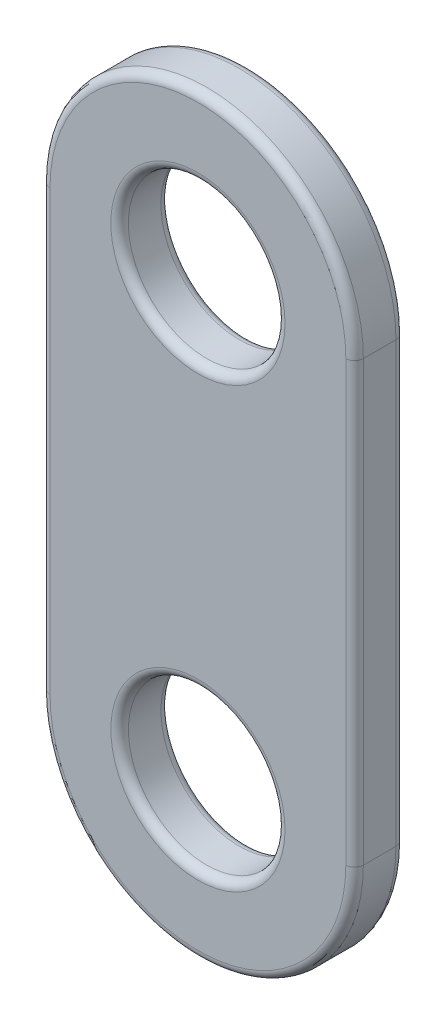
ISO-10303-21;
HEADER;
FILE_DESCRIPTION(('STEP AP214'),'2;1');
FILE_NAME('part.step','',(''),(''),'','','');
FILE_SCHEMA(('AUTOMOTIVE_DESIGN { 1 0 10303 214 1 1 1 1 }'));
ENDSEC;
DATA;
#1=APPLICATION_CONTEXT('core data for automotive mechanical design processes');
#2=APPLICATION_PROTOCOL_DEFINITION('international standard','automotive_design',2000,#1);
#3=PRODUCT_CONTEXT('',#1,'mechanical');
#4=PRODUCT('Part','Part','',(#3));
#5=PRODUCT_RELATED_PRODUCT_CATEGORY('part','',(#4));
#6=PRODUCT_DEFINITION_FORMATION('','',#4);
#7=PRODUCT_DEFINITION_CONTEXT('part definition',#1,'design');
#8=PRODUCT_DEFINITION('design','',#6,#7);
#9=PRODUCT_DEFINITION_SHAPE('','',#8);
#10=(LENGTH_UNIT() NAMED_UNIT(*) SI_UNIT(.MILLI.,.METRE.));
#11=(NAMED_UNIT(*) PLANE_ANGLE_UNIT() SI_UNIT($,.RADIAN.));
#12=(NAMED_UNIT(*) SI_UNIT($,.STERADIAN.) SOLID_ANGLE_UNIT());
#13=UNCERTAINTY_MEASURE_WITH_UNIT(LENGTH_MEASURE(1.E-05),#10,'distance_accuracy_value','');
#14=(GEOMETRIC_REPRESENTATION_CONTEXT(3) GLOBAL_UNCERTAINTY_ASSIGNED_CONTEXT((#13)) GLOBAL_UNIT_ASSIGNED_CONTEXT((#10,
#11,#12)) REPRESENTATION_CONTEXT('',''));
#15=CARTESIAN_POINT('',(0.,0.,0.));
#16=DIRECTION('',(0.,0.,1.));
#17=DIRECTION('',(1.,0.,0.));
#18=AXIS2_PLACEMENT_3D('',#15,#16,#17);
#19=CARTESIAN_POINT('',(0.,-22.225,0.));
#20=DIRECTION('',(0.,0.,-1.));
#21=DIRECTION('',(-1.,0.,0.));
#22=AXIS2_PLACEMENT_3D('',#19,#20,#21);
#23=CYLINDRICAL_SURFACE('',#22,15.875);
#24=DIRECTION('',(0.,0.,-1.));
#25=VECTOR('',#24,1.);
#26=CARTESIAN_POINT('',(-15.875,-22.225,5.08));
#27=LINE('',#26,#25);
#28=CARTESIAN_POINT('',(-15.875,-22.225,0.889));
#29=VERTEX_POINT('',#28);
#30=CARTESIAN_POINT('',(-15.875,-22.225,4.191));
#31=VERTEX_POINT('',#30);
#32=EDGE_CURVE('E239',#29,#31,#27,.F.);
#33=ORIENTED_EDGE('',*,*,#32,.F.);
#34=CARTESIAN_POINT('',(0.,-22.225,0.889));
#35=DIRECTION('',(0.,0.,1.));
#36=DIRECTION('',(1.,0.,0.));
#37=AXIS2_PLACEMENT_3D('',#34,#35,#36);
#38=CIRCLE('',#37,15.875);
#39=CARTESIAN_POINT('',(15.875,-22.225,0.889));
#40=VERTEX_POINT('',#39);
#41=EDGE_CURVE('E184',#29,#40,#38,.T.);
#42=ORIENTED_EDGE('',*,*,#41,.T.);
#43=DIRECTION('',(0.,0.,-1.));
#44=VECTOR('',#43,1.);
#45=CARTESIAN_POINT('',(15.875,-22.225,5.08));
#46=LINE('',#45,#44);
#47=CARTESIAN_POINT('',(15.875,-22.225,4.191));
#48=VERTEX_POINT('',#47);
#49=EDGE_CURVE('E133',#48,#40,#46,.T.);
#50=ORIENTED_EDGE('',*,*,#49,.F.);
#51=CARTESIAN_POINT('',(0.,-22.225,4.191));
#52=DIRECTION('',(0.,0.,1.));
#53=DIRECTION('',(1.,0.,0.));
#54=AXIS2_PLACEMENT_3D('',#51,#52,#53);
#55=CIRCLE('',#54,15.875);
#56=EDGE_CURVE('E181',#48,#31,#55,.F.);
#57=ORIENTED_EDGE('',*,*,#56,.T.);
#58=EDGE_LOOP('',(#33,#42,#50,#57));
#59=FACE_BOUND('',#58,.T.);
#60=ADVANCED_FACE('F43',(#59),#23,.T.);
#61=CARTESIAN_POINT('',(0.,22.225,0.));
#62=DIRECTION('',(0.,0.,-1.));
#63=DIRECTION('',(-1.,0.,0.));
#64=AXIS2_PLACEMENT_3D('',#61,#62,#63);
#65=CYLINDRICAL_SURFACE('',#64,15.875);
#66=DIRECTION('',(0.,0.,-1.));
#67=VECTOR('',#66,1.);
#68=CARTESIAN_POINT('',(15.875,22.225,5.08));
#69=LINE('',#68,#67);
#70=CARTESIAN_POINT('',(15.875,22.225,0.889));
#71=VERTEX_POINT('',#70);
#72=CARTESIAN_POINT('',(15.875,22.225,4.191));
#73=VERTEX_POINT('',#72);
#74=EDGE_CURVE('E214',#71,#73,#69,.F.);
#75=ORIENTED_EDGE('',*,*,#74,.F.);
#76=CARTESIAN_POINT('',(0.,22.225,0.889));
#77=DIRECTION('',(0.,0.,1.));
#78=DIRECTION('',(1.,0.,0.));
#79=AXIS2_PLACEMENT_3D('',#76,#77,#78);
#80=CIRCLE('',#79,15.875);
#81=CARTESIAN_POINT('',(-15.875,22.225,0.889));
#82=VERTEX_POINT('',#81);
#83=EDGE_CURVE('E118',#71,#82,#80,.T.);
#84=ORIENTED_EDGE('',*,*,#83,.T.);
#85=DIRECTION('',(0.,0.,-1.));
#86=VECTOR('',#85,1.);
#87=CARTESIAN_POINT('',(-15.875,22.225,5.08));
#88=LINE('',#87,#86);
#89=CARTESIAN_POINT('',(-15.875,22.225,4.191));
#90=VERTEX_POINT('',#89);
#91=EDGE_CURVE('E248',#90,#82,#88,.T.);
#92=ORIENTED_EDGE('',*,*,#91,.F.);
#93=CARTESIAN_POINT('',(0.,22.225,4.191));
#94=DIRECTION('',(0.,0.,1.));
#95=DIRECTION('',(1.,0.,0.));
#96=AXIS2_PLACEMENT_3D('',#93,#94,#95);
#97=CIRCLE('',#96,15.875);
#98=EDGE_CURVE('E169',#90,#73,#97,.F.);
#99=ORIENTED_EDGE('',*,*,#98,.T.);
#100=EDGE_LOOP('',(#75,#84,#92,#99));
#101=FACE_BOUND('',#100,.T.);
#102=ADVANCED_FACE('F263',(#101),#65,.T.);
#103=CARTESIAN_POINT('',(0.,0.,5.08));
#104=DIRECTION('',(0.,0.,1.));
#105=DIRECTION('',(1.,0.,0.));
#106=AXIS2_PLACEMENT_3D('',#103,#104,#105);
#107=PLANE('',#106);
#108=CARTESIAN_POINT('',(0.,-22.225,5.08));
#109=DIRECTION('',(0.,0.,1.));
#110=DIRECTION('',(1.,0.,0.));
#111=AXIS2_PLACEMENT_3D('',#108,#109,#110);
#112=CIRCLE('',#111,8.8265);
#113=CARTESIAN_POINT('',(8.82650000000001,-22.225,5.08));
#114=VERTEX_POINT('',#113);
#115=EDGE_CURVE('E11',#114,#114,#112,.F.);
#116=ORIENTED_EDGE('',*,*,#115,.T.);
#117=EDGE_LOOP('',(#116));
#118=FACE_BOUND('',#117,.T.);
#119=DIRECTION('',(0.,1.,0.));
#120=VECTOR('',#119,1.);
#121=CARTESIAN_POINT('',(14.986,22.225,5.08));
#122=LINE('',#121,#120);
#123=CARTESIAN_POINT('',(14.986,-22.225,5.08));
#124=VERTEX_POINT('',#123);
#125=CARTESIAN_POINT('',(14.986,22.225,5.08));
#126=VERTEX_POINT('',#125);
#127=EDGE_CURVE('E61',#124,#126,#122,.T.);
#128=ORIENTED_EDGE('',*,*,#127,.T.);
#129=CARTESIAN_POINT('',(0.,22.225,5.08));
#130=DIRECTION('',(0.,0.,1.));
#131=DIRECTION('',(1.,0.,0.));
#132=AXIS2_PLACEMENT_3D('',#129,#130,#131);
#133=CIRCLE('',#132,14.986);
#134=CARTESIAN_POINT('',(-14.986,22.225,5.08));
#135=VERTEX_POINT('',#134);
#136=EDGE_CURVE('E53',#126,#135,#133,.T.);
#137=ORIENTED_EDGE('',*,*,#136,.T.);
#138=DIRECTION('',(0.,-1.,0.));
#139=VECTOR('',#138,1.);
#140=CARTESIAN_POINT('',(-14.986,-22.225,5.08));
#141=LINE('',#140,#139);
#142=CARTESIAN_POINT('',(-14.986,-22.225,5.08));
#143=VERTEX_POINT('',#142);
#144=EDGE_CURVE('E197',#135,#143,#141,.T.);
#145=ORIENTED_EDGE('',*,*,#144,.T.);
#146=CARTESIAN_POINT('',(0.,-22.225,5.08));
#147=DIRECTION('',(0.,0.,1.));
#148=DIRECTION('',(1.,0.,0.));
#149=AXIS2_PLACEMENT_3D('',#146,#147,#148);
#150=CIRCLE('',#149,14.986);
#151=EDGE_CURVE('E66',#143,#124,#150,.T.);
#152=ORIENTED_EDGE('',*,*,#151,.T.);
#153=EDGE_LOOP('',(#128,#137,#145,#152));
#154=FACE_BOUND('',#153,.T.);
#155=CARTESIAN_POINT('',(0.,22.225,5.08));
#156=DIRECTION('',(0.,0.,1.));
#157=DIRECTION('',(1.,0.,0.));
#158=AXIS2_PLACEMENT_3D('',#155,#156,#157);
#159=CIRCLE('',#158,8.8265);
#160=CARTESIAN_POINT('',(8.82649999999999,22.225,5.08));
#161=VERTEX_POINT('',#160);
#162=EDGE_CURVE('E193',#161,#161,#159,.F.);
#163=ORIENTED_EDGE('',*,*,#162,.T.);
#164=EDGE_LOOP('',(#163));
#165=FACE_BOUND('',#164,.T.);
#166=ADVANCED_FACE('F277',(#118,#154,#165),#107,.T.);
#167=CARTESIAN_POINT('',(0.,0.,0.));
#168=DIRECTION('',(0.,0.,1.));
#169=DIRECTION('',(1.,0.,0.));
#170=AXIS2_PLACEMENT_3D('',#167,#168,#169);
#171=PLANE('',#170);
#172=CARTESIAN_POINT('',(0.,-22.225,0.));
#173=DIRECTION('',(0.,0.,1.));
#174=DIRECTION('',(1.,0.,0.));
#175=AXIS2_PLACEMENT_3D('',#172,#173,#174);
#176=CIRCLE('',#175,8.8265);
#177=CARTESIAN_POINT('',(8.82650000000001,-22.225,0.));
#178=VERTEX_POINT('',#177);
#179=EDGE_CURVE('E145',#178,#178,#176,.T.);
#180=ORIENTED_EDGE('',*,*,#179,.T.);
#181=EDGE_LOOP('',(#180));
#182=FACE_BOUND('',#181,.T.);
#183=CARTESIAN_POINT('',(0.,22.225,0.));
#184=DIRECTION('',(0.,0.,1.));
#185=DIRECTION('',(1.,0.,0.));
#186=AXIS2_PLACEMENT_3D('',#183,#184,#185);
#187=CIRCLE('',#186,8.8265);
#188=CARTESIAN_POINT('',(8.82649999999999,22.225,0.));
#189=VERTEX_POINT('',#188);
#190=EDGE_CURVE('E140',#189,#189,#187,.T.);
#191=ORIENTED_EDGE('',*,*,#190,.T.);
#192=EDGE_LOOP('',(#191));
#193=FACE_BOUND('',#192,.T.);
#194=DIRECTION('',(0.,-1.,0.));
#195=VECTOR('',#194,1.);
#196=CARTESIAN_POINT('',(-14.986,0.,0.));
#197=LINE('',#196,#195);
#198=CARTESIAN_POINT('',(-14.986,-22.225,0.));
#199=VERTEX_POINT('',#198);
#200=CARTESIAN_POINT('',(-14.986,22.225,0.));
#201=VERTEX_POINT('',#200);
#202=EDGE_CURVE('E137',#199,#201,#197,.F.);
#203=ORIENTED_EDGE('',*,*,#202,.T.);
#204=CARTESIAN_POINT('',(0.,22.225,0.));
#205=DIRECTION('',(0.,0.,1.));
#206=DIRECTION('',(1.,0.,0.));
#207=AXIS2_PLACEMENT_3D('',#204,#205,#206);
#208=CIRCLE('',#207,14.986);
#209=CARTESIAN_POINT('',(14.986,22.225,0.));
#210=VERTEX_POINT('',#209);
#211=EDGE_CURVE('E116',#201,#210,#208,.F.);
#212=ORIENTED_EDGE('',*,*,#211,.T.);
#213=DIRECTION('',(0.,1.,0.));
#214=VECTOR('',#213,1.);
#215=CARTESIAN_POINT('',(14.986,0.,0.));
#216=LINE('',#215,#214);
#217=CARTESIAN_POINT('',(14.986,-22.225,0.));
#218=VERTEX_POINT('',#217);
#219=EDGE_CURVE('E125',#210,#218,#216,.F.);
#220=ORIENTED_EDGE('',*,*,#219,.T.);
#221=CARTESIAN_POINT('',(0.,-22.225,0.));
#222=DIRECTION('',(0.,0.,1.));
#223=DIRECTION('',(1.,0.,0.));
#224=AXIS2_PLACEMENT_3D('',#221,#222,#223);
#225=CIRCLE('',#224,14.986);
#226=EDGE_CURVE('E132',#218,#199,#225,.F.);
#227=ORIENTED_EDGE('',*,*,#226,.T.);
#228=EDGE_LOOP('',(#203,#212,#220,#227));
#229=FACE_BOUND('',#228,.T.);
#230=ADVANCED_FACE('F135',(#182,#193,#229),#171,.F.);
#231=CARTESIAN_POINT('',(15.875,38.1,5.08));
#232=DIRECTION('',(-1.,0.,0.));
#233=DIRECTION('',(0.,-1.,0.));
#234=AXIS2_PLACEMENT_3D('',#231,#232,#233);
#235=PLANE('',#234);
#236=ORIENTED_EDGE('',*,*,#49,.T.);
#237=DIRECTION('',(0.,1.,0.));
#238=VECTOR('',#237,1.);
#239=CARTESIAN_POINT('',(15.875,38.1,0.889));
#240=LINE('',#239,#238);
#241=EDGE_CURVE('E190',#40,#71,#240,.T.);
#242=ORIENTED_EDGE('',*,*,#241,.T.);
#243=ORIENTED_EDGE('',*,*,#74,.T.);
#244=DIRECTION('',(0.,1.,0.));
#245=VECTOR('',#244,1.);
#246=CARTESIAN_POINT('',(15.875,-22.225,4.191));
#247=LINE('',#246,#245);
#248=EDGE_CURVE('E187',#73,#48,#247,.F.);
#249=ORIENTED_EDGE('',*,*,#248,.T.);
#250=EDGE_LOOP('',(#236,#242,#243,#249));
#251=FACE_BOUND('',#250,.T.);
#252=ADVANCED_FACE('F268',(#251),#235,.F.);
#253=CARTESIAN_POINT('',(-15.875,38.1,5.08));
#254=DIRECTION('',(1.,0.,0.));
#255=DIRECTION('',(0.,1.,0.));
#256=AXIS2_PLACEMENT_3D('',#253,#254,#255);
#257=PLANE('',#256);
#258=ORIENTED_EDGE('',*,*,#91,.T.);
#259=DIRECTION('',(0.,-1.,0.));
#260=VECTOR('',#259,1.);
#261=CARTESIAN_POINT('',(-15.875,38.1,0.889));
#262=LINE('',#261,#260);
#263=EDGE_CURVE('E178',#82,#29,#262,.T.);
#264=ORIENTED_EDGE('',*,*,#263,.T.);
#265=ORIENTED_EDGE('',*,*,#32,.T.);
#266=DIRECTION('',(0.,-1.,0.));
#267=VECTOR('',#266,1.);
#268=CARTESIAN_POINT('',(-15.875,22.225,4.191));
#269=LINE('',#268,#267);
#270=EDGE_CURVE('E175',#31,#90,#269,.F.);
#271=ORIENTED_EDGE('',*,*,#270,.T.);
#272=EDGE_LOOP('',(#258,#264,#265,#271));
#273=FACE_BOUND('',#272,.T.);
#274=ADVANCED_FACE('F244',(#273),#257,.F.);
#275=CARTESIAN_POINT('',(0.,22.225,5.08));
#276=DIRECTION('',(0.,0.,-1.));
#277=DIRECTION('',(-1.,0.,0.));
#278=AXIS2_PLACEMENT_3D('',#275,#276,#277);
#279=CYLINDRICAL_SURFACE('',#278,7.9375);
#280=CARTESIAN_POINT('',(0.,22.225,0.889));
#281=DIRECTION('',(0.,0.,1.));
#282=DIRECTION('',(1.,0.,0.));
#283=AXIS2_PLACEMENT_3D('',#280,#281,#282);
#284=CIRCLE('',#283,7.9375);
#285=CARTESIAN_POINT('',(7.93749999999999,22.225,0.889));
#286=VERTEX_POINT('',#285);
#287=EDGE_CURVE('E165',#286,#286,#284,.F.);
#288=ORIENTED_EDGE('',*,*,#287,.T.);
#289=EDGE_LOOP('',(#288));
#290=FACE_BOUND('',#289,.T.);
#291=CARTESIAN_POINT('',(0.,22.225,4.191));
#292=DIRECTION('',(0.,0.,1.));
#293=DIRECTION('',(1.,0.,0.));
#294=AXIS2_PLACEMENT_3D('',#291,#292,#293);
#295=CIRCLE('',#294,7.9375);
#296=CARTESIAN_POINT('',(7.93749999999999,22.225,4.191));
#297=VERTEX_POINT('',#296);
#298=EDGE_CURVE('E161',#297,#297,#295,.T.);
#299=ORIENTED_EDGE('',*,*,#298,.T.);
#300=EDGE_LOOP('',(#299));
#301=FACE_BOUND('',#300,.T.);
#302=ADVANCED_FACE('F275',(#290,#301),#279,.F.);
#303=CARTESIAN_POINT('',(0.,-22.225,5.08));
#304=DIRECTION('',(0.,0.,-1.));
#305=DIRECTION('',(-1.,0.,0.));
#306=AXIS2_PLACEMENT_3D('',#303,#304,#305);
#307=CYLINDRICAL_SURFACE('',#306,7.9375);
#308=CARTESIAN_POINT('',(0.,-22.225,0.889));
#309=DIRECTION('',(0.,0.,1.));
#310=DIRECTION('',(1.,0.,0.));
#311=AXIS2_PLACEMENT_3D('',#308,#309,#310);
#312=CIRCLE('',#311,7.9375);
#313=CARTESIAN_POINT('',(7.93750000000001,-22.225,0.889));
#314=VERTEX_POINT('',#313);
#315=EDGE_CURVE('E157',#314,#314,#312,.F.);
#316=ORIENTED_EDGE('',*,*,#315,.T.);
#317=EDGE_LOOP('',(#316));
#318=FACE_BOUND('',#317,.T.);
#319=CARTESIAN_POINT('',(0.,-22.225,4.191));
#320=DIRECTION('',(0.,0.,1.));
#321=DIRECTION('',(1.,0.,0.));
#322=AXIS2_PLACEMENT_3D('',#319,#320,#321);
#323=CIRCLE('',#322,7.9375);
#324=CARTESIAN_POINT('',(7.93750000000001,-22.225,4.191));
#325=VERTEX_POINT('',#324);
#326=EDGE_CURVE('E153',#325,#325,#323,.T.);
#327=ORIENTED_EDGE('',*,*,#326,.T.);
#328=EDGE_LOOP('',(#327));
#329=FACE_BOUND('',#328,.T.);
#330=ADVANCED_FACE('F295',(#318,#329),#307,.F.);
#331=CARTESIAN_POINT('',(0.,-22.225,0.889));
#332=DIRECTION('',(0.,0.,1.));
#333=DIRECTION('',(1.,0.,0.));
#334=AXIS2_PLACEMENT_3D('',#331,#332,#333);
#335=TOROIDAL_SURFACE('',#334,8.8265,0.889);
#336=ORIENTED_EDGE('',*,*,#315,.F.);
#337=EDGE_LOOP('',(#336));
#338=FACE_BOUND('',#337,.T.);
#339=ORIENTED_EDGE('',*,*,#179,.F.);
#340=EDGE_LOOP('',(#339));
#341=FACE_BOUND('',#340,.T.);
#342=ADVANCED_FACE('F291',(#338,#341),#335,.T.);
#343=CARTESIAN_POINT('',(0.,22.225,0.889));
#344=DIRECTION('',(0.,0.,1.));
#345=DIRECTION('',(1.,0.,0.));
#346=AXIS2_PLACEMENT_3D('',#343,#344,#345);
#347=TOROIDAL_SURFACE('',#346,8.8265,0.889);
#348=ORIENTED_EDGE('',*,*,#287,.F.);
#349=EDGE_LOOP('',(#348));
#350=FACE_BOUND('',#349,.T.);
#351=ORIENTED_EDGE('',*,*,#190,.F.);
#352=EDGE_LOOP('',(#351));
#353=FACE_BOUND('',#352,.T.);
#354=ADVANCED_FACE('F294',(#350,#353),#347,.T.);
#355=CARTESIAN_POINT('',(0.,-22.225,0.889));
#356=DIRECTION('',(0.,0.,1.));
#357=DIRECTION('',(1.,0.,0.));
#358=AXIS2_PLACEMENT_3D('',#355,#356,#357);
#359=TOROIDAL_SURFACE('',#358,14.986,0.889);
#360=CARTESIAN_POINT('',(14.986,-22.225,0.889));
#361=DIRECTION('',(0.,1.,0.));
#362=DIRECTION('',(0.,0.,1.));
#363=AXIS2_PLACEMENT_3D('',#360,#361,#362);
#364=CIRCLE('',#363,0.889);
#365=EDGE_CURVE('E128',#40,#218,#364,.T.);
#366=ORIENTED_EDGE('',*,*,#365,.F.);
#367=ORIENTED_EDGE('',*,*,#41,.F.);
#368=CARTESIAN_POINT('',(-14.986,-22.225,0.889));
#369=DIRECTION('',(0.,1.,0.));
#370=DIRECTION('',(0.,0.,1.));
#371=AXIS2_PLACEMENT_3D('',#368,#369,#370);
#372=CIRCLE('',#371,0.889);
#373=EDGE_CURVE('E210',#199,#29,#372,.T.);
#374=ORIENTED_EDGE('',*,*,#373,.F.);
#375=ORIENTED_EDGE('',*,*,#226,.F.);
#376=EDGE_LOOP('',(#366,#367,#374,#375));
#377=FACE_BOUND('',#376,.T.);
#378=ADVANCED_FACE('F258',(#377),#359,.T.);
#379=CARTESIAN_POINT('',(-14.986,38.1,0.889));
#380=DIRECTION('',(0.,-1.,0.));
#381=DIRECTION('',(1.,0.,0.));
#382=AXIS2_PLACEMENT_3D('',#379,#380,#381);
#383=CYLINDRICAL_SURFACE('',#382,0.889);
#384=ORIENTED_EDGE('',*,*,#373,.T.);
#385=ORIENTED_EDGE('',*,*,#263,.F.);
#386=CARTESIAN_POINT('',(-14.986,22.225,0.889));
#387=DIRECTION('',(0.,1.,0.));
#388=DIRECTION('',(0.,0.,1.));
#389=AXIS2_PLACEMENT_3D('',#386,#387,#388);
#390=CIRCLE('',#389,0.889);
#391=EDGE_CURVE('E122',#201,#82,#390,.T.);
#392=ORIENTED_EDGE('',*,*,#391,.F.);
#393=ORIENTED_EDGE('',*,*,#202,.F.);
#394=EDGE_LOOP('',(#384,#385,#392,#393));
#395=FACE_BOUND('',#394,.T.);
#396=ADVANCED_FACE('F260',(#395),#383,.T.);
#397=CARTESIAN_POINT('',(14.986,38.1,0.889));
#398=DIRECTION('',(0.,1.,0.));
#399=DIRECTION('',(-1.,0.,0.));
#400=AXIS2_PLACEMENT_3D('',#397,#398,#399);
#401=CYLINDRICAL_SURFACE('',#400,0.889);
#402=ORIENTED_EDGE('',*,*,#365,.T.);
#403=ORIENTED_EDGE('',*,*,#219,.F.);
#404=CARTESIAN_POINT('',(14.986,22.225,0.889));
#405=DIRECTION('',(0.,1.,0.));
#406=DIRECTION('',(0.,0.,1.));
#407=AXIS2_PLACEMENT_3D('',#404,#405,#406);
#408=CIRCLE('',#407,0.889);
#409=EDGE_CURVE('E112',#71,#210,#408,.T.);
#410=ORIENTED_EDGE('',*,*,#409,.F.);
#411=ORIENTED_EDGE('',*,*,#241,.F.);
#412=EDGE_LOOP('',(#402,#403,#410,#411));
#413=FACE_BOUND('',#412,.T.);
#414=ADVANCED_FACE('F126',(#413),#401,.T.);
#415=CARTESIAN_POINT('',(0.,22.225,0.889));
#416=DIRECTION('',(0.,0.,1.));
#417=DIRECTION('',(1.,0.,0.));
#418=AXIS2_PLACEMENT_3D('',#415,#416,#417);
#419=TOROIDAL_SURFACE('',#418,14.986,0.889);
#420=ORIENTED_EDGE('',*,*,#391,.T.);
#421=ORIENTED_EDGE('',*,*,#83,.F.);
#422=ORIENTED_EDGE('',*,*,#409,.T.);
#423=ORIENTED_EDGE('',*,*,#211,.F.);
#424=EDGE_LOOP('',(#420,#421,#422,#423));
#425=FACE_BOUND('',#424,.T.);
#426=ADVANCED_FACE('F114',(#425),#419,.T.);
#427=CARTESIAN_POINT('',(0.,-22.225,4.191));
#428=DIRECTION('',(0.,0.,1.));
#429=DIRECTION('',(1.,0.,0.));
#430=AXIS2_PLACEMENT_3D('',#427,#428,#429);
#431=TOROIDAL_SURFACE('',#430,8.8265,0.889);
#432=ORIENTED_EDGE('',*,*,#115,.F.);
#433=EDGE_LOOP('',(#432));
#434=FACE_BOUND('',#433,.T.);
#435=ORIENTED_EDGE('',*,*,#326,.F.);
#436=EDGE_LOOP('',(#435));
#437=FACE_BOUND('',#436,.T.);
#438=ADVANCED_FACE('F302',(#434,#437),#431,.T.);
#439=CARTESIAN_POINT('',(0.,-22.225,4.191));
#440=DIRECTION('',(0.,0.,1.));
#441=DIRECTION('',(1.,0.,0.));
#442=AXIS2_PLACEMENT_3D('',#439,#440,#441);
#443=TOROIDAL_SURFACE('',#442,14.986,0.889);
#444=CARTESIAN_POINT('',(-14.986,-22.225,4.191));
#445=DIRECTION('',(0.,1.,0.));
#446=DIRECTION('',(0.,0.,1.));
#447=AXIS2_PLACEMENT_3D('',#444,#445,#446);
#448=CIRCLE('',#447,0.889);
#449=EDGE_CURVE('E220',#31,#143,#448,.T.);
#450=ORIENTED_EDGE('',*,*,#449,.F.);
#451=ORIENTED_EDGE('',*,*,#56,.F.);
#452=CARTESIAN_POINT('',(14.986,-22.225,4.191));
#453=DIRECTION('',(0.,1.,0.));
#454=DIRECTION('',(0.,0.,1.));
#455=AXIS2_PLACEMENT_3D('',#452,#453,#454);
#456=CIRCLE('',#455,0.889);
#457=EDGE_CURVE('E47',#124,#48,#456,.T.);
#458=ORIENTED_EDGE('',*,*,#457,.F.);
#459=ORIENTED_EDGE('',*,*,#151,.F.);
#460=EDGE_LOOP('',(#450,#451,#458,#459));
#461=FACE_BOUND('',#460,.T.);
#462=ADVANCED_FACE('F234',(#461),#443,.T.);
#463=CARTESIAN_POINT('',(14.986,0.,4.191));
#464=DIRECTION('',(0.,-1.,0.));
#465=DIRECTION('',(1.,0.,0.));
#466=AXIS2_PLACEMENT_3D('',#463,#464,#465);
#467=CYLINDRICAL_SURFACE('',#466,0.889);
#468=ORIENTED_EDGE('',*,*,#457,.T.);
#469=ORIENTED_EDGE('',*,*,#248,.F.);
#470=CARTESIAN_POINT('',(14.986,22.225,4.191));
#471=DIRECTION('',(0.,1.,0.));
#472=DIRECTION('',(0.,0.,1.));
#473=AXIS2_PLACEMENT_3D('',#470,#471,#472);
#474=CIRCLE('',#473,0.889);
#475=EDGE_CURVE('E218',#126,#73,#474,.T.);
#476=ORIENTED_EDGE('',*,*,#475,.F.);
#477=ORIENTED_EDGE('',*,*,#127,.F.);
#478=EDGE_LOOP('',(#468,#469,#476,#477));
#479=FACE_BOUND('',#478,.T.);
#480=ADVANCED_FACE('F231',(#479),#467,.T.);
#481=CARTESIAN_POINT('',(-14.986,0.,4.191));
#482=DIRECTION('',(0.,1.,0.));
#483=DIRECTION('',(-1.,0.,0.));
#484=AXIS2_PLACEMENT_3D('',#481,#482,#483);
#485=CYLINDRICAL_SURFACE('',#484,0.889);
#486=ORIENTED_EDGE('',*,*,#449,.T.);
#487=ORIENTED_EDGE('',*,*,#144,.F.);
#488=CARTESIAN_POINT('',(-14.986,22.225,4.191));
#489=DIRECTION('',(0.,1.,0.));
#490=DIRECTION('',(0.,0.,1.));
#491=AXIS2_PLACEMENT_3D('',#488,#489,#490);
#492=CIRCLE('',#491,0.889);
#493=EDGE_CURVE('E215',#90,#135,#492,.T.);
#494=ORIENTED_EDGE('',*,*,#493,.F.);
#495=ORIENTED_EDGE('',*,*,#270,.F.);
#496=EDGE_LOOP('',(#486,#487,#494,#495));
#497=FACE_BOUND('',#496,.T.);
#498=ADVANCED_FACE('F315',(#497),#485,.T.);
#499=CARTESIAN_POINT('',(0.,22.225,4.191));
#500=DIRECTION('',(0.,0.,1.));
#501=DIRECTION('',(1.,0.,0.));
#502=AXIS2_PLACEMENT_3D('',#499,#500,#501);
#503=TOROIDAL_SURFACE('',#502,14.986,0.889);
#504=ORIENTED_EDGE('',*,*,#475,.T.);
#505=ORIENTED_EDGE('',*,*,#98,.F.);
#506=ORIENTED_EDGE('',*,*,#493,.T.);
#507=ORIENTED_EDGE('',*,*,#136,.F.);
#508=EDGE_LOOP('',(#504,#505,#506,#507));
#509=FACE_BOUND('',#508,.T.);
#510=ADVANCED_FACE('F312',(#509),#503,.T.);
#511=CARTESIAN_POINT('',(0.,22.225,4.191));
#512=DIRECTION('',(0.,0.,1.));
#513=DIRECTION('',(1.,0.,0.));
#514=AXIS2_PLACEMENT_3D('',#511,#512,#513);
#515=TOROIDAL_SURFACE('',#514,8.8265,0.889);
#516=ORIENTED_EDGE('',*,*,#162,.F.);
#517=EDGE_LOOP('',(#516));
#518=FACE_BOUND('',#517,.T.);
#519=ORIENTED_EDGE('',*,*,#298,.F.);
#520=EDGE_LOOP('',(#519));
#521=FACE_BOUND('',#520,.T.);
#522=ADVANCED_FACE('F45',(#518,#521),#515,.T.);
#523=CLOSED_SHELL('',(#60,#102,#166,#230,#252,#274,#302,#330,#342,#354,#378,#396,#414,#426,#438,
#462,#480,#498,#510,#522));
#524=MANIFOLD_SOLID_BREP('B2',#523);
#525=ADVANCED_BREP_SHAPE_REPRESENTATION('',(#18,#524),#14);
#526=SHAPE_DEFINITION_REPRESENTATION(#9,#525);
ENDSEC;
END-ISO-10303-21;
